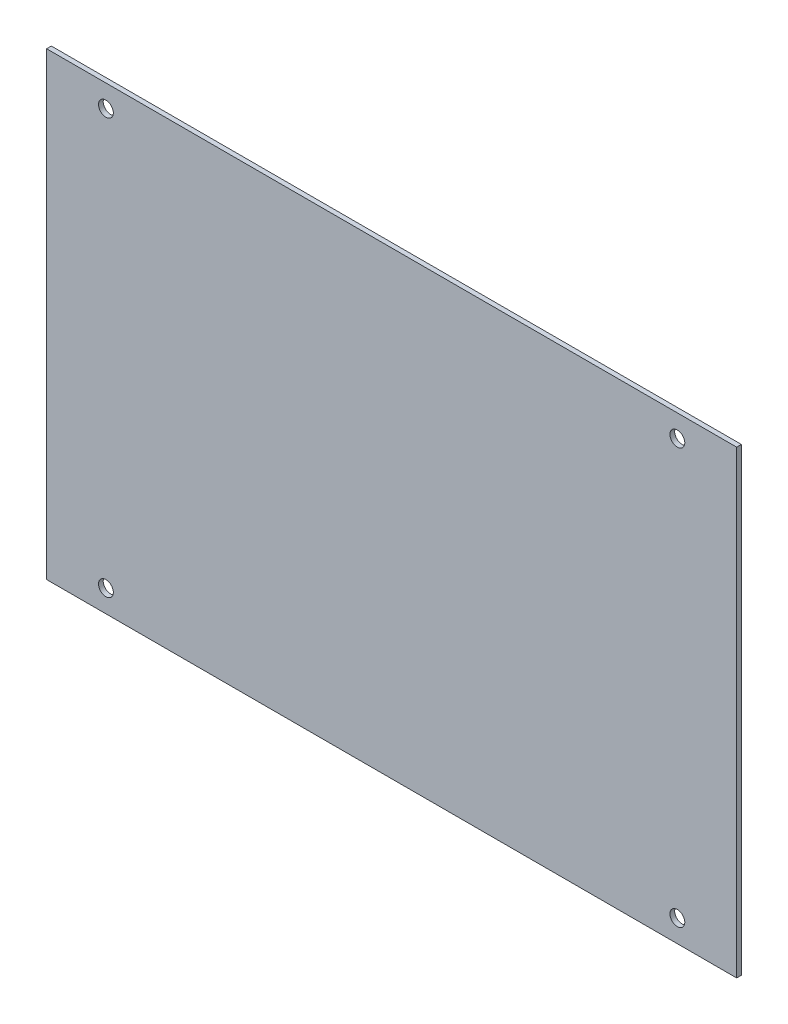
ISO-10303-21;
HEADER;
FILE_DESCRIPTION(('STEP AP214'),'2;1');
FILE_NAME('part.step','',(''),(''),'','','');
FILE_SCHEMA(('AUTOMOTIVE_DESIGN { 1 0 10303 214 1 1 1 1 }'));
ENDSEC;
DATA;
#1=APPLICATION_CONTEXT('core data for automotive mechanical design processes');
#2=APPLICATION_PROTOCOL_DEFINITION('international standard','automotive_design',2000,#1);
#3=PRODUCT_CONTEXT('',#1,'mechanical');
#4=PRODUCT('Part','Part','',(#3));
#5=PRODUCT_RELATED_PRODUCT_CATEGORY('part','',(#4));
#6=PRODUCT_DEFINITION_FORMATION('','',#4);
#7=PRODUCT_DEFINITION_CONTEXT('part definition',#1,'design');
#8=PRODUCT_DEFINITION('design','',#6,#7);
#9=PRODUCT_DEFINITION_SHAPE('','',#8);
#10=(LENGTH_UNIT() NAMED_UNIT(*) SI_UNIT(.MILLI.,.METRE.));
#11=(NAMED_UNIT(*) PLANE_ANGLE_UNIT() SI_UNIT($,.RADIAN.));
#12=(NAMED_UNIT(*) SI_UNIT($,.STERADIAN.) SOLID_ANGLE_UNIT());
#13=UNCERTAINTY_MEASURE_WITH_UNIT(LENGTH_MEASURE(1.E-05),#10,'distance_accuracy_value','');
#14=(GEOMETRIC_REPRESENTATION_CONTEXT(3) GLOBAL_UNCERTAINTY_ASSIGNED_CONTEXT((#13)) GLOBAL_UNIT_ASSIGNED_CONTEXT((#10,
#11,#12)) REPRESENTATION_CONTEXT('',''));
#15=CARTESIAN_POINT('',(0.,0.,0.));
#16=DIRECTION('',(0.,0.,1.));
#17=DIRECTION('',(1.,0.,0.));
#18=AXIS2_PLACEMENT_3D('',#15,#16,#17);
#19=CARTESIAN_POINT('',(-82.7574262073641,17.771163649572,1.5875));
#20=DIRECTION('',(1.,0.,0.));
#21=DIRECTION('',(0.,1.,0.));
#22=AXIS2_PLACEMENT_3D('',#19,#20,#21);
#23=PLANE('',#22);
#24=DIRECTION('',(0.,-1.,0.));
#25=VECTOR('',#24,1.);
#26=CARTESIAN_POINT('',(-82.7574262073641,17.771163649572,0.));
#27=LINE('',#26,#25);
#28=CARTESIAN_POINT('',(-82.7574262073641,17.771163649572,0.));
#29=VERTEX_POINT('',#28);
#30=CARTESIAN_POINT('',(-82.7574262073641,-137.228836350428,0.));
#31=VERTEX_POINT('',#30);
#32=EDGE_CURVE('E103',#29,#31,#27,.T.);
#33=ORIENTED_EDGE('',*,*,#32,.T.);
#34=DIRECTION('',(0.,0.,-1.));
#35=VECTOR('',#34,1.);
#36=CARTESIAN_POINT('',(-82.7574262073641,-137.228836350428,1.5875));
#37=LINE('',#36,#35);
#38=CARTESIAN_POINT('',(-82.7574262073641,-137.228836350428,1.5875));
#39=VERTEX_POINT('',#38);
#40=EDGE_CURVE('E11',#39,#31,#37,.T.);
#41=ORIENTED_EDGE('',*,*,#40,.F.);
#42=DIRECTION('',(0.,-1.,0.));
#43=VECTOR('',#42,1.);
#44=CARTESIAN_POINT('',(-82.7574262073641,17.771163649572,1.5875));
#45=LINE('',#44,#43);
#46=CARTESIAN_POINT('',(-82.7574262073641,17.771163649572,1.5875));
#47=VERTEX_POINT('',#46);
#48=EDGE_CURVE('E80',#47,#39,#45,.T.);
#49=ORIENTED_EDGE('',*,*,#48,.F.);
#50=DIRECTION('',(0.,0.,-1.));
#51=VECTOR('',#50,1.);
#52=CARTESIAN_POINT('',(-82.7574262073641,17.771163649572,1.5875));
#53=LINE('',#52,#51);
#54=EDGE_CURVE('E56',#47,#29,#53,.T.);
#55=ORIENTED_EDGE('',*,*,#54,.T.);
#56=EDGE_LOOP('',(#33,#41,#49,#55));
#57=FACE_BOUND('',#56,.T.);
#58=ADVANCED_FACE('F40',(#57),#23,.F.);
#59=CARTESIAN_POINT('',(149.910225392636,-137.228836350428,1.5875));
#60=DIRECTION('',(0.,-1.,0.));
#61=DIRECTION('',(1.,0.,0.));
#62=AXIS2_PLACEMENT_3D('',#59,#60,#61);
#63=PLANE('',#62);
#64=DIRECTION('',(-1.,0.,0.));
#65=VECTOR('',#64,1.);
#66=CARTESIAN_POINT('',(149.910225392636,-137.228836350428,0.));
#67=LINE('',#66,#65);
#68=CARTESIAN_POINT('',(149.910225392636,-137.228836350428,0.));
#69=VERTEX_POINT('',#68);
#70=EDGE_CURVE('E89',#69,#31,#67,.T.);
#71=ORIENTED_EDGE('',*,*,#70,.F.);
#72=DIRECTION('',(0.,0.,-1.));
#73=VECTOR('',#72,1.);
#74=CARTESIAN_POINT('',(149.910225392636,-137.228836350428,1.5875));
#75=LINE('',#74,#73);
#76=CARTESIAN_POINT('',(149.910225392636,-137.228836350428,1.5875));
#77=VERTEX_POINT('',#76);
#78=EDGE_CURVE('E48',#77,#69,#75,.T.);
#79=ORIENTED_EDGE('',*,*,#78,.F.);
#80=DIRECTION('',(-1.,0.,0.));
#81=VECTOR('',#80,1.);
#82=CARTESIAN_POINT('',(149.910225392636,-137.228836350428,1.5875));
#83=LINE('',#82,#81);
#84=EDGE_CURVE('E87',#77,#39,#83,.T.);
#85=ORIENTED_EDGE('',*,*,#84,.T.);
#86=ORIENTED_EDGE('',*,*,#40,.T.);
#87=EDGE_LOOP('',(#71,#79,#85,#86));
#88=FACE_BOUND('',#87,.T.);
#89=ADVANCED_FACE('F86',(#88),#63,.T.);
#90=CARTESIAN_POINT('',(149.910225392636,17.771163649572,1.5875));
#91=DIRECTION('',(1.,0.,0.));
#92=DIRECTION('',(0.,1.,0.));
#93=AXIS2_PLACEMENT_3D('',#90,#91,#92);
#94=PLANE('',#93);
#95=DIRECTION('',(0.,-1.,0.));
#96=VECTOR('',#95,1.);
#97=CARTESIAN_POINT('',(149.910225392636,17.771163649572,0.));
#98=LINE('',#97,#96);
#99=CARTESIAN_POINT('',(149.910225392636,17.771163649572,0.));
#100=VERTEX_POINT('',#99);
#101=EDGE_CURVE('E107',#100,#69,#98,.T.);
#102=ORIENTED_EDGE('',*,*,#101,.F.);
#103=DIRECTION('',(0.,0.,-1.));
#104=VECTOR('',#103,1.);
#105=CARTESIAN_POINT('',(149.910225392636,17.771163649572,1.5875));
#106=LINE('',#105,#104);
#107=CARTESIAN_POINT('',(149.910225392636,17.771163649572,1.5875));
#108=VERTEX_POINT('',#107);
#109=EDGE_CURVE('E69',#108,#100,#106,.T.);
#110=ORIENTED_EDGE('',*,*,#109,.F.);
#111=DIRECTION('',(0.,-1.,0.));
#112=VECTOR('',#111,1.);
#113=CARTESIAN_POINT('',(149.910225392636,17.771163649572,1.5875));
#114=LINE('',#113,#112);
#115=EDGE_CURVE('E95',#108,#77,#114,.T.);
#116=ORIENTED_EDGE('',*,*,#115,.T.);
#117=ORIENTED_EDGE('',*,*,#78,.T.);
#118=EDGE_LOOP('',(#102,#110,#116,#117));
#119=FACE_BOUND('',#118,.T.);
#120=ADVANCED_FACE('F97',(#119),#94,.T.);
#121=CARTESIAN_POINT('',(-82.7574262073641,17.771163649572,1.5875));
#122=DIRECTION('',(0.,1.,0.));
#123=DIRECTION('',(0.,0.,1.));
#124=AXIS2_PLACEMENT_3D('',#121,#122,#123);
#125=PLANE('',#124);
#126=DIRECTION('',(1.,0.,0.));
#127=VECTOR('',#126,1.);
#128=CARTESIAN_POINT('',(-82.7574262073641,17.771163649572,0.));
#129=LINE('',#128,#127);
#130=EDGE_CURVE('E109',#29,#100,#129,.T.);
#131=ORIENTED_EDGE('',*,*,#130,.F.);
#132=ORIENTED_EDGE('',*,*,#54,.F.);
#133=DIRECTION('',(1.,0.,0.));
#134=VECTOR('',#133,1.);
#135=CARTESIAN_POINT('',(-82.7574262073641,17.771163649572,1.5875));
#136=LINE('',#135,#134);
#137=EDGE_CURVE('E98',#47,#108,#136,.T.);
#138=ORIENTED_EDGE('',*,*,#137,.T.);
#139=ORIENTED_EDGE('',*,*,#109,.T.);
#140=EDGE_LOOP('',(#131,#132,#138,#139));
#141=FACE_BOUND('',#140,.T.);
#142=ADVANCED_FACE('F144',(#141),#125,.T.);
#143=CARTESIAN_POINT('',(0.,0.,1.5875));
#144=DIRECTION('',(0.,0.,-1.));
#145=DIRECTION('',(-1.,0.,0.));
#146=AXIS2_PLACEMENT_3D('',#143,#144,#145);
#147=PLANE('',#146);
#148=CARTESIAN_POINT('',(129.910225392636,10.271163649572,1.5875));
#149=DIRECTION('',(0.,0.,1.));
#150=DIRECTION('',(1.,0.,0.));
#151=AXIS2_PLACEMENT_3D('',#148,#149,#150);
#152=CIRCLE('',#151,2.5);
#153=CARTESIAN_POINT('',(132.410225392636,10.271163649572,1.5875));
#154=VERTEX_POINT('',#153);
#155=EDGE_CURVE('E118',#154,#154,#152,.T.);
#156=ORIENTED_EDGE('',*,*,#155,.F.);
#157=EDGE_LOOP('',(#156));
#158=FACE_BOUND('',#157,.T.);
#159=CARTESIAN_POINT('',(-62.7574262073641,-129.728836350428,1.5875));
#160=DIRECTION('',(0.,0.,1.));
#161=DIRECTION('',(1.,0.,0.));
#162=AXIS2_PLACEMENT_3D('',#159,#160,#161);
#163=CIRCLE('',#162,2.5);
#164=CARTESIAN_POINT('',(-60.2574262073641,-129.728836350428,1.5875));
#165=VERTEX_POINT('',#164);
#166=EDGE_CURVE('E124',#165,#165,#163,.T.);
#167=ORIENTED_EDGE('',*,*,#166,.F.);
#168=EDGE_LOOP('',(#167));
#169=FACE_BOUND('',#168,.T.);
#170=CARTESIAN_POINT('',(129.910225392636,-129.728836350428,1.5875));
#171=DIRECTION('',(0.,0.,1.));
#172=DIRECTION('',(1.,0.,0.));
#173=AXIS2_PLACEMENT_3D('',#170,#171,#172);
#174=CIRCLE('',#173,2.5);
#175=CARTESIAN_POINT('',(132.410225392636,-129.728836350428,1.5875));
#176=VERTEX_POINT('',#175);
#177=EDGE_CURVE('E125',#176,#176,#174,.T.);
#178=ORIENTED_EDGE('',*,*,#177,.F.);
#179=EDGE_LOOP('',(#178));
#180=FACE_BOUND('',#179,.T.);
#181=CARTESIAN_POINT('',(-62.7574262073641,10.271163649572,1.5875));
#182=DIRECTION('',(0.,0.,1.));
#183=DIRECTION('',(1.,0.,0.));
#184=AXIS2_PLACEMENT_3D('',#181,#182,#183);
#185=CIRCLE('',#184,2.5);
#186=CARTESIAN_POINT('',(-60.2574262073641,10.271163649572,1.5875));
#187=VERTEX_POINT('',#186);
#188=EDGE_CURVE('E115',#187,#187,#185,.T.);
#189=ORIENTED_EDGE('',*,*,#188,.F.);
#190=EDGE_LOOP('',(#189));
#191=FACE_BOUND('',#190,.T.);
#192=ORIENTED_EDGE('',*,*,#48,.T.);
#193=ORIENTED_EDGE('',*,*,#84,.F.);
#194=ORIENTED_EDGE('',*,*,#115,.F.);
#195=ORIENTED_EDGE('',*,*,#137,.F.);
#196=EDGE_LOOP('',(#192,#193,#194,#195));
#197=FACE_BOUND('',#196,.T.);
#198=ADVANCED_FACE('F94',(#158,#169,#180,#191,#197),#147,.F.);
#199=CARTESIAN_POINT('',(0.,0.,0.));
#200=DIRECTION('',(0.,0.,-1.));
#201=DIRECTION('',(-1.,0.,0.));
#202=AXIS2_PLACEMENT_3D('',#199,#200,#201);
#203=PLANE('',#202);
#204=CARTESIAN_POINT('',(129.910225392636,10.271163649572,0.));
#205=DIRECTION('',(0.,0.,1.));
#206=DIRECTION('',(1.,0.,0.));
#207=AXIS2_PLACEMENT_3D('',#204,#205,#206);
#208=CIRCLE('',#207,2.5);
#209=CARTESIAN_POINT('',(132.410225392636,10.271163649572,0.));
#210=VERTEX_POINT('',#209);
#211=EDGE_CURVE('E128',#210,#210,#208,.T.);
#212=ORIENTED_EDGE('',*,*,#211,.T.);
#213=EDGE_LOOP('',(#212));
#214=FACE_BOUND('',#213,.T.);
#215=CARTESIAN_POINT('',(-62.7574262073641,-129.728836350428,0.));
#216=DIRECTION('',(0.,0.,1.));
#217=DIRECTION('',(1.,0.,0.));
#218=AXIS2_PLACEMENT_3D('',#215,#216,#217);
#219=CIRCLE('',#218,2.5);
#220=CARTESIAN_POINT('',(-60.2574262073641,-129.728836350428,0.));
#221=VERTEX_POINT('',#220);
#222=EDGE_CURVE('E121',#221,#221,#219,.T.);
#223=ORIENTED_EDGE('',*,*,#222,.T.);
#224=EDGE_LOOP('',(#223));
#225=FACE_BOUND('',#224,.T.);
#226=CARTESIAN_POINT('',(129.910225392636,-129.728836350428,0.));
#227=DIRECTION('',(0.,0.,1.));
#228=DIRECTION('',(1.,0.,0.));
#229=AXIS2_PLACEMENT_3D('',#226,#227,#228);
#230=CIRCLE('',#229,2.5);
#231=CARTESIAN_POINT('',(132.410225392636,-129.728836350428,0.));
#232=VERTEX_POINT('',#231);
#233=EDGE_CURVE('E133',#232,#232,#230,.T.);
#234=ORIENTED_EDGE('',*,*,#233,.T.);
#235=EDGE_LOOP('',(#234));
#236=FACE_BOUND('',#235,.T.);
#237=CARTESIAN_POINT('',(-62.7574262073641,10.271163649572,0.));
#238=DIRECTION('',(0.,0.,1.));
#239=DIRECTION('',(1.,0.,0.));
#240=AXIS2_PLACEMENT_3D('',#237,#238,#239);
#241=CIRCLE('',#240,2.5);
#242=CARTESIAN_POINT('',(-60.2574262073641,10.271163649572,0.));
#243=VERTEX_POINT('',#242);
#244=EDGE_CURVE('E105',#243,#243,#241,.T.);
#245=ORIENTED_EDGE('',*,*,#244,.T.);
#246=EDGE_LOOP('',(#245));
#247=FACE_BOUND('',#246,.T.);
#248=ORIENTED_EDGE('',*,*,#32,.F.);
#249=ORIENTED_EDGE('',*,*,#130,.T.);
#250=ORIENTED_EDGE('',*,*,#101,.T.);
#251=ORIENTED_EDGE('',*,*,#70,.T.);
#252=EDGE_LOOP('',(#248,#249,#250,#251));
#253=FACE_BOUND('',#252,.T.);
#254=ADVANCED_FACE('F143',(#214,#225,#236,#247,#253),#203,.T.);
#255=CARTESIAN_POINT('',(-62.7574262073641,10.271163649572,0.));
#256=DIRECTION('',(0.,0.,1.));
#257=DIRECTION('',(1.,0.,0.));
#258=AXIS2_PLACEMENT_3D('',#255,#256,#257);
#259=CYLINDRICAL_SURFACE('',#258,2.5);
#260=ORIENTED_EDGE('',*,*,#244,.F.);
#261=EDGE_LOOP('',(#260));
#262=FACE_BOUND('',#261,.T.);
#263=ORIENTED_EDGE('',*,*,#188,.T.);
#264=EDGE_LOOP('',(#263));
#265=FACE_BOUND('',#264,.T.);
#266=ADVANCED_FACE('F149',(#262,#265),#259,.F.);
#267=CARTESIAN_POINT('',(129.910225392636,-129.728836350428,0.));
#268=DIRECTION('',(0.,0.,1.));
#269=DIRECTION('',(1.,0.,0.));
#270=AXIS2_PLACEMENT_3D('',#267,#268,#269);
#271=CYLINDRICAL_SURFACE('',#270,2.5);
#272=ORIENTED_EDGE('',*,*,#233,.F.);
#273=EDGE_LOOP('',(#272));
#274=FACE_BOUND('',#273,.T.);
#275=ORIENTED_EDGE('',*,*,#177,.T.);
#276=EDGE_LOOP('',(#275));
#277=FACE_BOUND('',#276,.T.);
#278=ADVANCED_FACE('F139',(#274,#277),#271,.F.);
#279=CARTESIAN_POINT('',(-62.7574262073641,-129.728836350428,0.));
#280=DIRECTION('',(0.,0.,1.));
#281=DIRECTION('',(1.,0.,0.));
#282=AXIS2_PLACEMENT_3D('',#279,#280,#281);
#283=CYLINDRICAL_SURFACE('',#282,2.5);
#284=ORIENTED_EDGE('',*,*,#222,.F.);
#285=EDGE_LOOP('',(#284));
#286=FACE_BOUND('',#285,.T.);
#287=ORIENTED_EDGE('',*,*,#166,.T.);
#288=EDGE_LOOP('',(#287));
#289=FACE_BOUND('',#288,.T.);
#290=ADVANCED_FACE('F157',(#286,#289),#283,.F.);
#291=CARTESIAN_POINT('',(129.910225392636,10.271163649572,0.));
#292=DIRECTION('',(0.,0.,1.));
#293=DIRECTION('',(1.,0.,0.));
#294=AXIS2_PLACEMENT_3D('',#291,#292,#293);
#295=CYLINDRICAL_SURFACE('',#294,2.5);
#296=ORIENTED_EDGE('',*,*,#211,.F.);
#297=EDGE_LOOP('',(#296));
#298=FACE_BOUND('',#297,.T.);
#299=ORIENTED_EDGE('',*,*,#155,.T.);
#300=EDGE_LOOP('',(#299));
#301=FACE_BOUND('',#300,.T.);
#302=ADVANCED_FACE('F229',(#298,#301),#295,.F.);
#303=CLOSED_SHELL('',(#58,#89,#120,#142,#198,#254,#266,#278,#290,#302));
#304=MANIFOLD_SOLID_BREP('B2',#303);
#305=ADVANCED_BREP_SHAPE_REPRESENTATION('',(#18,#304),#14);
#306=SHAPE_DEFINITION_REPRESENTATION(#9,#305);
ENDSEC;
END-ISO-10303-21;
